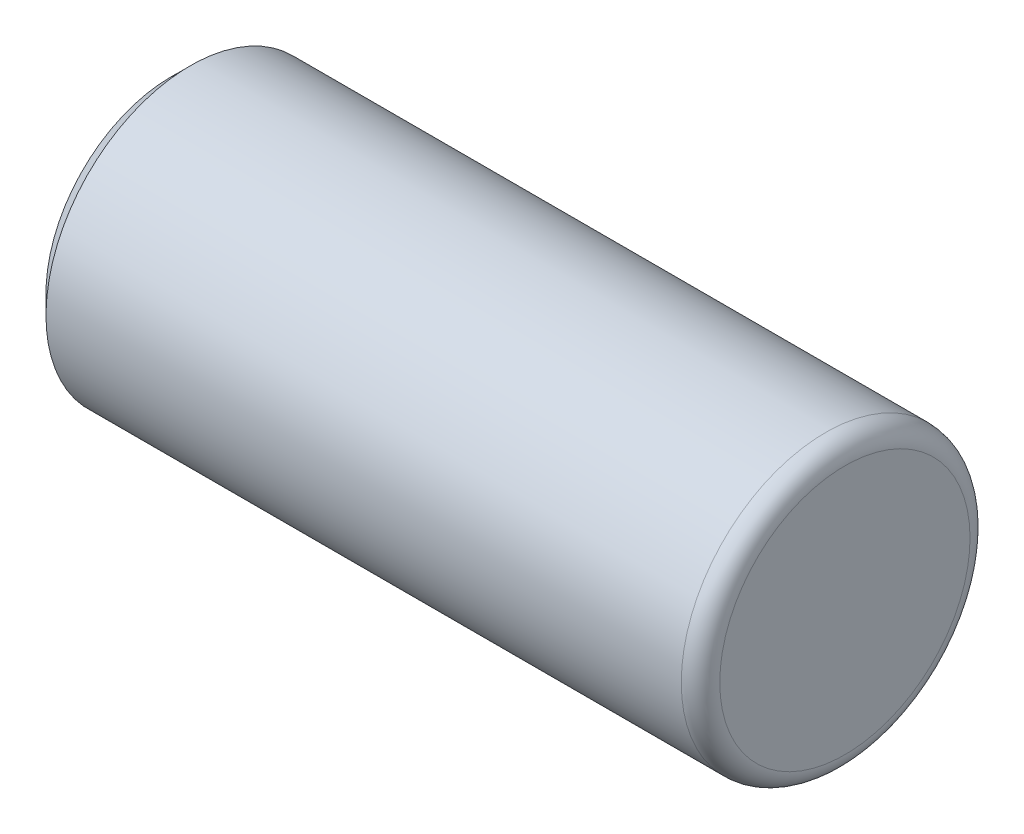
ISO-10303-21;
HEADER;
FILE_DESCRIPTION(('STEP AP214'),'2;1');
FILE_NAME('part.step','',(''),(''),'','','');
FILE_SCHEMA(('AUTOMOTIVE_DESIGN { 1 0 10303 214 1 1 1 1 }'));
ENDSEC;
DATA;
#1=APPLICATION_CONTEXT('core data for automotive mechanical design processes');
#2=APPLICATION_PROTOCOL_DEFINITION('international standard','automotive_design',2000,#1);
#3=PRODUCT_CONTEXT('',#1,'mechanical');
#4=PRODUCT('Part','Part','',(#3));
#5=PRODUCT_RELATED_PRODUCT_CATEGORY('part','',(#4));
#6=PRODUCT_DEFINITION_FORMATION('','',#4);
#7=PRODUCT_DEFINITION_CONTEXT('part definition',#1,'design');
#8=PRODUCT_DEFINITION('design','',#6,#7);
#9=PRODUCT_DEFINITION_SHAPE('','',#8);
#10=(LENGTH_UNIT() NAMED_UNIT(*) SI_UNIT(.MILLI.,.METRE.));
#11=(NAMED_UNIT(*) PLANE_ANGLE_UNIT() SI_UNIT($,.RADIAN.));
#12=(NAMED_UNIT(*) SI_UNIT($,.STERADIAN.) SOLID_ANGLE_UNIT());
#13=UNCERTAINTY_MEASURE_WITH_UNIT(LENGTH_MEASURE(1.E-05),#10,'distance_accuracy_value','');
#14=(GEOMETRIC_REPRESENTATION_CONTEXT(3) GLOBAL_UNCERTAINTY_ASSIGNED_CONTEXT((#13)) GLOBAL_UNIT_ASSIGNED_CONTEXT((#10,
#11,#12)) REPRESENTATION_CONTEXT('',''));
#15=CARTESIAN_POINT('',(0.,0.,0.));
#16=DIRECTION('',(0.,0.,1.));
#17=DIRECTION('',(1.,0.,0.));
#18=AXIS2_PLACEMENT_3D('',#15,#16,#17);
#19=CARTESIAN_POINT('',(574.152262189073,977.504433652101,20.));
#20=DIRECTION('',(-1.,0.,0.));
#21=DIRECTION('',(0.,0.,-1.));
#22=AXIS2_PLACEMENT_3D('',#19,#20,#21);
#23=PLANE('',#22);
#24=CARTESIAN_POINT('',(574.152262189073,978.585270427388,20.));
#25=DIRECTION('',(-1.,0.,0.));
#26=DIRECTION('',(0.,0.,1.));
#27=AXIS2_PLACEMENT_3D('',#24,#25,#26);
#28=CIRCLE('',#27,13.);
#29=CARTESIAN_POINT('',(574.152262189073,978.585270427388,33.));
#30=VERTEX_POINT('',#29);
#31=EDGE_CURVE('E11',#30,#30,#28,.F.);
#32=ORIENTED_EDGE('',*,*,#31,.T.);
#33=EDGE_LOOP('',(#32));
#34=FACE_BOUND('',#33,.T.);
#35=ADVANCED_FACE('F43',(#34),#23,.F.);
#36=CARTESIAN_POINT('',(574.152262189073,978.585270427388,20.));
#37=DIRECTION('',(1.,0.,0.));
#38=DIRECTION('',(0.,-0.963788819653397,0.266666666666669));
#39=AXIS2_PLACEMENT_3D('',#36,#37,#38);
#40=CYLINDRICAL_SURFACE('',#39,15.);
#41=CARTESIAN_POINT('',(572.152262189073,978.585270427388,20.));
#42=DIRECTION('',(-1.,0.,0.));
#43=DIRECTION('',(0.,0.,1.));
#44=AXIS2_PLACEMENT_3D('',#41,#42,#43);
#45=CIRCLE('',#44,15.);
#46=CARTESIAN_POINT('',(572.152262189073,978.585270427388,35.));
#47=VERTEX_POINT('',#46);
#48=EDGE_CURVE('E52',#47,#47,#45,.T.);
#49=ORIENTED_EDGE('',*,*,#48,.T.);
#50=EDGE_LOOP('',(#49));
#51=FACE_BOUND('',#50,.T.);
#52=CARTESIAN_POINT('',(506.152262189073,978.585270427388,20.));
#53=DIRECTION('',(-1.,0.,0.));
#54=DIRECTION('',(0.,0.963788819653397,-0.266666666666669));
#55=AXIS2_PLACEMENT_3D('',#52,#53,#54);
#56=CIRCLE('',#55,15.);
#57=CARTESIAN_POINT('',(506.152262189073,964.128438132587,24.));
#58=VERTEX_POINT('',#57);
#59=CARTESIAN_POINT('',(506.152262189073,964.128438132587,16.));
#60=VERTEX_POINT('',#59);
#61=EDGE_CURVE('E101',#58,#60,#56,.T.);
#62=ORIENTED_EDGE('',*,*,#61,.F.);
#63=DIRECTION('',(-1.,0.,0.));
#64=VECTOR('',#63,1.);
#65=CARTESIAN_POINT('',(574.152262189073,964.128438132587,24.));
#66=LINE('',#65,#64);
#67=CARTESIAN_POINT('',(554.152262189073,964.128438132587,24.));
#68=VERTEX_POINT('',#67);
#69=EDGE_CURVE('E115',#68,#58,#66,.T.);
#70=ORIENTED_EDGE('',*,*,#69,.F.);
#71=CARTESIAN_POINT('',(554.152262189073,978.585270427388,20.));
#72=DIRECTION('',(-1.,0.,0.));
#73=DIRECTION('',(0.,-0.963788819653397,-0.266666666666666));
#74=AXIS2_PLACEMENT_3D('',#71,#72,#73);
#75=CIRCLE('',#74,15.);
#76=CARTESIAN_POINT('',(554.152262189073,964.128438132587,16.));
#77=VERTEX_POINT('',#76);
#78=EDGE_CURVE('E141',#77,#68,#75,.T.);
#79=ORIENTED_EDGE('',*,*,#78,.F.);
#80=DIRECTION('',(-1.,0.,0.));
#81=VECTOR('',#80,1.);
#82=CARTESIAN_POINT('',(574.152262189073,964.128438132587,16.));
#83=LINE('',#82,#81);
#84=EDGE_CURVE('E133',#77,#60,#83,.T.);
#85=ORIENTED_EDGE('',*,*,#84,.T.);
#86=EDGE_LOOP('',(#62,#70,#79,#85));
#87=FACE_BOUND('',#86,.T.);
#88=ADVANCED_FACE('F172',(#51,#87),#40,.T.);
#89=CARTESIAN_POINT('',(574.152262189073,967.585270427388,16.));
#90=DIRECTION('',(0.,-1.,0.));
#91=DIRECTION('',(0.,0.,1.));
#92=AXIS2_PLACEMENT_3D('',#89,#90,#91);
#93=PLANE('',#92);
#94=DIRECTION('',(0.,0.,-1.));
#95=VECTOR('',#94,1.);
#96=CARTESIAN_POINT('',(552.152262189073,967.585270427388,18.));
#97=LINE('',#96,#95);
#98=CARTESIAN_POINT('',(552.152262189073,967.585270427388,24.));
#99=VERTEX_POINT('',#98);
#100=CARTESIAN_POINT('',(552.152262189073,967.585270427388,16.));
#101=VERTEX_POINT('',#100);
#102=EDGE_CURVE('E131',#99,#101,#97,.T.);
#103=ORIENTED_EDGE('',*,*,#102,.F.);
#104=DIRECTION('',(-1.,0.,0.));
#105=VECTOR('',#104,1.);
#106=CARTESIAN_POINT('',(574.152262189073,967.585270427388,24.));
#107=LINE('',#106,#105);
#108=CARTESIAN_POINT('',(504.152262189073,967.585270427388,24.));
#109=VERTEX_POINT('',#108);
#110=EDGE_CURVE('E109',#99,#109,#107,.T.);
#111=ORIENTED_EDGE('',*,*,#110,.T.);
#112=DIRECTION('',(0.,0.,1.));
#113=VECTOR('',#112,1.);
#114=CARTESIAN_POINT('',(504.152262189073,967.585270427388,16.));
#115=LINE('',#114,#113);
#116=CARTESIAN_POINT('',(504.152262189073,967.585270427388,16.));
#117=VERTEX_POINT('',#116);
#118=EDGE_CURVE('E106',#117,#109,#115,.T.);
#119=ORIENTED_EDGE('',*,*,#118,.F.);
#120=DIRECTION('',(-1.,0.,0.));
#121=VECTOR('',#120,1.);
#122=CARTESIAN_POINT('',(574.152262189073,967.585270427388,16.));
#123=LINE('',#122,#121);
#124=EDGE_CURVE('E60',#101,#117,#123,.T.);
#125=ORIENTED_EDGE('',*,*,#124,.F.);
#126=EDGE_LOOP('',(#103,#111,#119,#125));
#127=FACE_BOUND('',#126,.T.);
#128=ADVANCED_FACE('F171',(#127),#93,.T.);
#129=CARTESIAN_POINT('',(574.152262189073,964.128438132587,16.));
#130=DIRECTION('',(0.,0.,1.));
#131=DIRECTION('',(0.,1.,0.));
#132=AXIS2_PLACEMENT_3D('',#129,#130,#131);
#133=PLANE('',#132);
#134=CARTESIAN_POINT('',(552.152262189073,965.585270427388,16.));
#135=DIRECTION('',(0.,0.,1.));
#136=DIRECTION('',(0.707106781186548,0.707106781186548,0.));
#137=AXIS2_PLACEMENT_3D('',#134,#135,#136);
#138=CIRCLE('',#137,2.);
#139=CARTESIAN_POINT('',(554.152262189073,965.585270427388,16.));
#140=VERTEX_POINT('',#139);
#141=EDGE_CURVE('E147',#140,#101,#138,.T.);
#142=ORIENTED_EDGE('',*,*,#141,.T.);
#143=ORIENTED_EDGE('',*,*,#124,.T.);
#144=DIRECTION('',(0.,1.,0.));
#145=VECTOR('',#144,1.);
#146=CARTESIAN_POINT('',(504.152262189073,964.128438132587,16.));
#147=LINE('',#146,#145);
#148=CARTESIAN_POINT('',(504.152262189073,966.215953550535,16.));
#149=VERTEX_POINT('',#148);
#150=EDGE_CURVE('E127',#149,#117,#147,.T.);
#151=ORIENTED_EDGE('',*,*,#150,.F.);
#152=CARTESIAN_POINT('',(506.152262189073,964.128438132588,16.0000000000001));
#153=CARTESIAN_POINT('',(505.074445749433,965.246749963626,16.0000000000001));
#154=CARTESIAN_POINT('',(504.152262189073,966.215953550535,16.));
#155=(BOUNDED_CURVE() B_SPLINE_CURVE(2,(#152,#153,#154),.UNSPECIFIED.,.F.,
.F.) B_SPLINE_CURVE_WITH_KNOTS((3,3),(64.9361637614732,71.0682518353248),
.UNSPECIFIED.) CURVE() GEOMETRIC_REPRESENTATION_ITEM() RATIONAL_B_SPLINE_CURVE((1.05332774941701,
1.02918181261292,1.)) REPRESENTATION_ITEM(''));
#156=EDGE_CURVE('E98',#60,#149,#155,.T.);
#157=ORIENTED_EDGE('',*,*,#156,.F.);
#158=ORIENTED_EDGE('',*,*,#84,.F.);
#159=DIRECTION('',(0.,1.,0.));
#160=VECTOR('',#159,1.);
#161=CARTESIAN_POINT('',(554.152262189073,965.019643915201,16.));
#162=LINE('',#161,#160);
#163=EDGE_CURVE('E153',#77,#140,#162,.T.);
#164=ORIENTED_EDGE('',*,*,#163,.T.);
#165=EDGE_LOOP('',(#142,#143,#151,#157,#158,#164));
#166=FACE_BOUND('',#165,.T.);
#167=ADVANCED_FACE('F165',(#166),#133,.T.);
#168=CARTESIAN_POINT('',(504.152262189073,977.504433652101,20.));
#169=DIRECTION('',(-1.,0.,0.));
#170=DIRECTION('',(0.,0.,-1.));
#171=AXIS2_PLACEMENT_3D('',#168,#169,#170);
#172=PLANE('',#171);
#173=CARTESIAN_POINT('',(504.152262189073,978.585270427388,20.));
#174=DIRECTION('',(1.,0.,0.));
#175=DIRECTION('',(0.,0.963788819653397,-0.266666666666669));
#176=AXIS2_PLACEMENT_3D('',#173,#174,#175);
#177=CIRCLE('',#176,13.);
#178=CARTESIAN_POINT('',(504.152262189073,966.215953550535,24.));
#179=VERTEX_POINT('',#178);
#180=EDGE_CURVE('E90',#149,#179,#177,.T.);
#181=ORIENTED_EDGE('',*,*,#180,.F.);
#182=ORIENTED_EDGE('',*,*,#150,.T.);
#183=ORIENTED_EDGE('',*,*,#118,.T.);
#184=DIRECTION('',(0.,-1.,0.));
#185=VECTOR('',#184,1.);
#186=CARTESIAN_POINT('',(504.152262189073,967.585270427388,24.));
#187=LINE('',#186,#185);
#188=EDGE_CURVE('E104',#109,#179,#187,.T.);
#189=ORIENTED_EDGE('',*,*,#188,.T.);
#190=EDGE_LOOP('',(#181,#182,#183,#189));
#191=FACE_BOUND('',#190,.T.);
#192=ADVANCED_FACE('F105',(#191),#172,.T.);
#193=CARTESIAN_POINT('',(505.152262189073,978.585270427388,20.));
#194=DIRECTION('',(1.,0.,0.));
#195=DIRECTION('',(0.,0.963788819653397,-0.266666666666669));
#196=AXIS2_PLACEMENT_3D('',#193,#194,#195);
#197=CONICAL_SURFACE('',#196,14.,0.785398163397436);
#198=ORIENTED_EDGE('',*,*,#156,.T.);
#199=ORIENTED_EDGE('',*,*,#180,.T.);
#200=CARTESIAN_POINT('',(504.152262189073,966.215953550535,24.));
#201=CARTESIAN_POINT('',(505.074445749432,965.246749963625,24.));
#202=CARTESIAN_POINT('',(506.152262189073,964.128438132587,24.0000000000001));
#203=(BOUNDED_CURVE() B_SPLINE_CURVE(2,(#200,#201,#202),.UNSPECIFIED.,.F.,
.F.) B_SPLINE_CURVE_WITH_KNOTS((3,3),(0.,6.13208807385683),
.UNSPECIFIED.) CURVE() GEOMETRIC_REPRESENTATION_ITEM() RATIONAL_B_SPLINE_CURVE((1.,
1.02918181261303,1.0533277494172)) REPRESENTATION_ITEM(''));
#204=EDGE_CURVE('E95',#179,#58,#203,.T.);
#205=ORIENTED_EDGE('',*,*,#204,.T.);
#206=ORIENTED_EDGE('',*,*,#61,.T.);
#207=EDGE_LOOP('',(#198,#199,#205,#206));
#208=FACE_BOUND('',#207,.T.);
#209=ADVANCED_FACE('F92',(#208),#197,.T.);
#210=CARTESIAN_POINT('',(554.152262189073,965.910849697814,20.));
#211=DIRECTION('',(-1.,0.,0.));
#212=DIRECTION('',(0.,0.,-1.));
#213=AXIS2_PLACEMENT_3D('',#210,#211,#212);
#214=PLANE('',#213);
#215=DIRECTION('',(0.,0.,1.));
#216=VECTOR('',#215,1.);
#217=CARTESIAN_POINT('',(554.152262189073,965.585270427388,18.));
#218=LINE('',#217,#216);
#219=CARTESIAN_POINT('',(554.152262189073,965.585270427388,24.));
#220=VERTEX_POINT('',#219);
#221=EDGE_CURVE('E143',#140,#220,#218,.T.);
#222=ORIENTED_EDGE('',*,*,#221,.F.);
#223=ORIENTED_EDGE('',*,*,#163,.F.);
#224=ORIENTED_EDGE('',*,*,#78,.T.);
#225=DIRECTION('',(0.,-1.,0.));
#226=VECTOR('',#225,1.);
#227=CARTESIAN_POINT('',(554.152262189073,966.748060062601,24.));
#228=LINE('',#227,#226);
#229=EDGE_CURVE('E117',#220,#68,#228,.T.);
#230=ORIENTED_EDGE('',*,*,#229,.F.);
#231=EDGE_LOOP('',(#222,#223,#224,#230));
#232=FACE_BOUND('',#231,.T.);
#233=ADVANCED_FACE('F173',(#232),#214,.T.);
#234=CARTESIAN_POINT('',(574.152262189073,967.585270427388,24.));
#235=DIRECTION('',(0.,0.,-1.));
#236=DIRECTION('',(0.,-1.,0.));
#237=AXIS2_PLACEMENT_3D('',#234,#235,#236);
#238=PLANE('',#237);
#239=CARTESIAN_POINT('',(552.152262189073,965.585270427388,24.));
#240=DIRECTION('',(0.,0.,-1.));
#241=DIRECTION('',(0.707106781186548,0.707106781186548,0.));
#242=AXIS2_PLACEMENT_3D('',#239,#240,#241);
#243=CIRCLE('',#242,2.);
#244=EDGE_CURVE('E129',#99,#220,#243,.T.);
#245=ORIENTED_EDGE('',*,*,#244,.T.);
#246=ORIENTED_EDGE('',*,*,#229,.T.);
#247=ORIENTED_EDGE('',*,*,#69,.T.);
#248=ORIENTED_EDGE('',*,*,#204,.F.);
#249=ORIENTED_EDGE('',*,*,#188,.F.);
#250=ORIENTED_EDGE('',*,*,#110,.F.);
#251=EDGE_LOOP('',(#245,#246,#247,#248,#249,#250));
#252=FACE_BOUND('',#251,.T.);
#253=ADVANCED_FACE('F112',(#252),#238,.T.);
#254=CARTESIAN_POINT('',(552.152262189073,965.585270427388,18.));
#255=DIRECTION('',(0.,0.,-1.));
#256=DIRECTION('',(0.707106781186548,0.707106781186548,0.));
#257=AXIS2_PLACEMENT_3D('',#254,#255,#256);
#258=CYLINDRICAL_SURFACE('',#257,2.);
#259=ORIENTED_EDGE('',*,*,#244,.F.);
#260=ORIENTED_EDGE('',*,*,#102,.T.);
#261=ORIENTED_EDGE('',*,*,#141,.F.);
#262=ORIENTED_EDGE('',*,*,#221,.T.);
#263=EDGE_LOOP('',(#259,#260,#261,#262));
#264=FACE_BOUND('',#263,.T.);
#265=ADVANCED_FACE('F169',(#264),#258,.F.);
#266=CARTESIAN_POINT('',(572.152262189073,978.585270427388,20.));
#267=DIRECTION('',(-1.,0.,0.));
#268=DIRECTION('',(0.,0.,1.));
#269=AXIS2_PLACEMENT_3D('',#266,#267,#268);
#270=TOROIDAL_SURFACE('',#269,13.,2.);
#271=ORIENTED_EDGE('',*,*,#31,.F.);
#272=EDGE_LOOP('',(#271));
#273=FACE_BOUND('',#272,.T.);
#274=ORIENTED_EDGE('',*,*,#48,.F.);
#275=EDGE_LOOP('',(#274));
#276=FACE_BOUND('',#275,.T.);
#277=ADVANCED_FACE('F45',(#273,#276),#270,.T.);
#278=CLOSED_SHELL('',(#35,#88,#128,#167,#192,#209,#233,#253,#265,#277));
#279=MANIFOLD_SOLID_BREP('B2',#278);
#280=ADVANCED_BREP_SHAPE_REPRESENTATION('',(#18,#279),#14);
#281=SHAPE_DEFINITION_REPRESENTATION(#9,#280);
ENDSEC;
END-ISO-10303-21;
